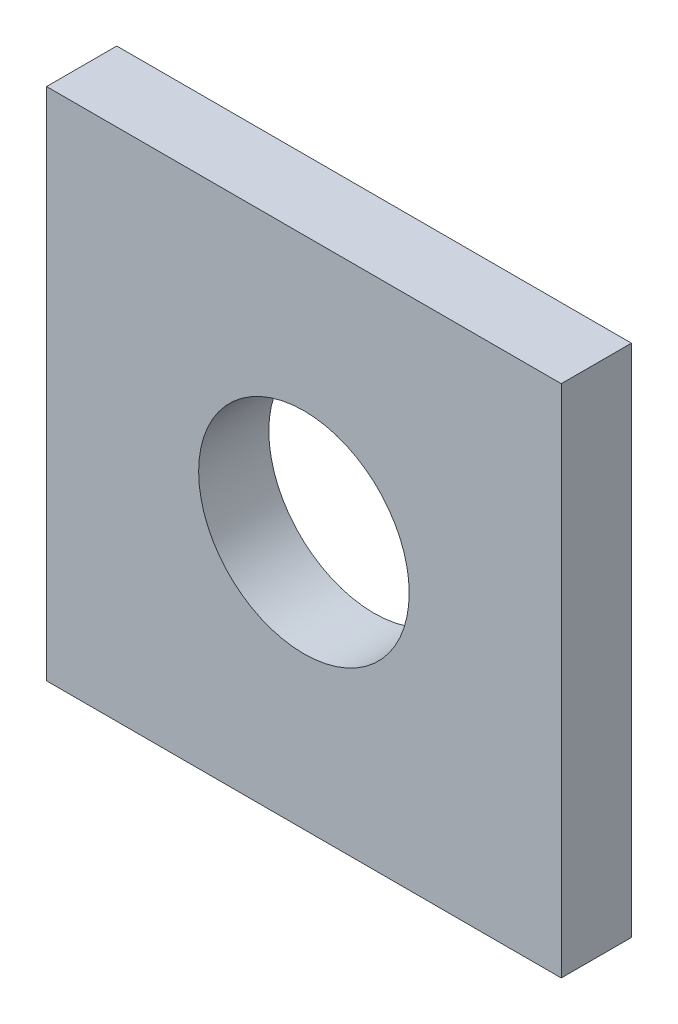
ISO-10303-21;
HEADER;
FILE_DESCRIPTION(('STEP AP214'),'2;1');
FILE_NAME('part.step','',(''),(''),'','','');
FILE_SCHEMA(('AUTOMOTIVE_DESIGN { 1 0 10303 214 1 1 1 1 }'));
ENDSEC;
DATA;
#1=APPLICATION_CONTEXT('core data for automotive mechanical design processes');
#2=APPLICATION_PROTOCOL_DEFINITION('international standard','automotive_design',2000,#1);
#3=PRODUCT_CONTEXT('',#1,'mechanical');
#4=PRODUCT('Part','Part','',(#3));
#5=PRODUCT_RELATED_PRODUCT_CATEGORY('part','',(#4));
#6=PRODUCT_DEFINITION_FORMATION('','',#4);
#7=PRODUCT_DEFINITION_CONTEXT('part definition',#1,'design');
#8=PRODUCT_DEFINITION('design','',#6,#7);
#9=PRODUCT_DEFINITION_SHAPE('','',#8);
#10=(LENGTH_UNIT() NAMED_UNIT(*) SI_UNIT(.MILLI.,.METRE.));
#11=(NAMED_UNIT(*) PLANE_ANGLE_UNIT() SI_UNIT($,.RADIAN.));
#12=(NAMED_UNIT(*) SI_UNIT($,.STERADIAN.) SOLID_ANGLE_UNIT());
#13=UNCERTAINTY_MEASURE_WITH_UNIT(LENGTH_MEASURE(1.E-05),#10,'distance_accuracy_value','');
#14=(GEOMETRIC_REPRESENTATION_CONTEXT(3) GLOBAL_UNCERTAINTY_ASSIGNED_CONTEXT((#13)) GLOBAL_UNIT_ASSIGNED_CONTEXT((#10,
#11,#12)) REPRESENTATION_CONTEXT('',''));
#15=CARTESIAN_POINT('',(0.,0.,0.));
#16=DIRECTION('',(0.,0.,1.));
#17=DIRECTION('',(1.,0.,0.));
#18=AXIS2_PLACEMENT_3D('',#15,#16,#17);
#19=CARTESIAN_POINT('',(0.,0.,3.));
#20=DIRECTION('',(0.,0.,-1.));
#21=DIRECTION('',(-1.,0.,0.));
#22=AXIS2_PLACEMENT_3D('',#19,#20,#21);
#23=PLANE('',#22);
#24=DIRECTION('',(0.,-1.,0.));
#25=VECTOR('',#24,1.);
#26=CARTESIAN_POINT('',(0.,0.,3.));
#27=LINE('',#26,#25);
#28=CARTESIAN_POINT('',(0.,22.,3.));
#29=VERTEX_POINT('',#28);
#30=CARTESIAN_POINT('',(0.,0.,3.));
#31=VERTEX_POINT('',#30);
#32=EDGE_CURVE('E99',#29,#31,#27,.T.);
#33=ORIENTED_EDGE('',*,*,#32,.T.);
#34=DIRECTION('',(1.,0.,0.));
#35=VECTOR('',#34,1.);
#36=CARTESIAN_POINT('',(0.,0.,3.));
#37=LINE('',#36,#35);
#38=CARTESIAN_POINT('',(22.,0.,3.));
#39=VERTEX_POINT('',#38);
#40=EDGE_CURVE('E94',#31,#39,#37,.T.);
#41=ORIENTED_EDGE('',*,*,#40,.T.);
#42=DIRECTION('',(0.,1.,0.));
#43=VECTOR('',#42,1.);
#44=CARTESIAN_POINT('',(22.,0.,3.));
#45=LINE('',#44,#43);
#46=CARTESIAN_POINT('',(22.,22.,3.));
#47=VERTEX_POINT('',#46);
#48=EDGE_CURVE('E97',#39,#47,#45,.T.);
#49=ORIENTED_EDGE('',*,*,#48,.T.);
#50=DIRECTION('',(-1.,0.,0.));
#51=VECTOR('',#50,1.);
#52=CARTESIAN_POINT('',(0.,22.,3.));
#53=LINE('',#52,#51);
#54=EDGE_CURVE('E64',#47,#29,#53,.T.);
#55=ORIENTED_EDGE('',*,*,#54,.T.);
#56=EDGE_LOOP('',(#33,#41,#49,#55));
#57=FACE_BOUND('',#56,.T.);
#58=CARTESIAN_POINT('',(11.,11.,3.));
#59=DIRECTION('',(0.,0.,1.));
#60=DIRECTION('',(1.,0.,0.));
#61=AXIS2_PLACEMENT_3D('',#58,#59,#60);
#62=CIRCLE('',#61,4.5);
#63=CARTESIAN_POINT('',(15.5,11.,3.));
#64=VERTEX_POINT('',#63);
#65=EDGE_CURVE('E114',#64,#64,#62,.T.);
#66=ORIENTED_EDGE('',*,*,#65,.F.);
#67=EDGE_LOOP('',(#66));
#68=FACE_BOUND('',#67,.T.);
#69=ADVANCED_FACE('F47',(#57,#68),#23,.F.);
#70=CARTESIAN_POINT('',(0.,0.,0.));
#71=DIRECTION('',(0.,0.,-1.));
#72=DIRECTION('',(-1.,0.,0.));
#73=AXIS2_PLACEMENT_3D('',#70,#71,#72);
#74=PLANE('',#73);
#75=DIRECTION('',(0.,-1.,0.));
#76=VECTOR('',#75,1.);
#77=CARTESIAN_POINT('',(0.,0.,0.));
#78=LINE('',#77,#76);
#79=CARTESIAN_POINT('',(0.,22.,0.));
#80=VERTEX_POINT('',#79);
#81=CARTESIAN_POINT('',(0.,0.,0.));
#82=VERTEX_POINT('',#81);
#83=EDGE_CURVE('E111',#80,#82,#78,.T.);
#84=ORIENTED_EDGE('',*,*,#83,.F.);
#85=DIRECTION('',(-1.,0.,0.));
#86=VECTOR('',#85,1.);
#87=CARTESIAN_POINT('',(0.,22.,0.));
#88=LINE('',#87,#86);
#89=CARTESIAN_POINT('',(22.,22.,0.));
#90=VERTEX_POINT('',#89);
#91=EDGE_CURVE('E87',#90,#80,#88,.T.);
#92=ORIENTED_EDGE('',*,*,#91,.F.);
#93=DIRECTION('',(0.,1.,0.));
#94=VECTOR('',#93,1.);
#95=CARTESIAN_POINT('',(22.,0.,0.));
#96=LINE('',#95,#94);
#97=CARTESIAN_POINT('',(22.,0.,0.));
#98=VERTEX_POINT('',#97);
#99=EDGE_CURVE('E81',#98,#90,#96,.T.);
#100=ORIENTED_EDGE('',*,*,#99,.F.);
#101=DIRECTION('',(1.,0.,0.));
#102=VECTOR('',#101,1.);
#103=CARTESIAN_POINT('',(0.,0.,0.));
#104=LINE('',#103,#102);
#105=EDGE_CURVE('E103',#82,#98,#104,.T.);
#106=ORIENTED_EDGE('',*,*,#105,.F.);
#107=EDGE_LOOP('',(#84,#92,#100,#106));
#108=FACE_BOUND('',#107,.T.);
#109=CARTESIAN_POINT('',(11.,11.,0.));
#110=DIRECTION('',(0.,0.,1.));
#111=DIRECTION('',(1.,0.,0.));
#112=AXIS2_PLACEMENT_3D('',#109,#110,#111);
#113=CIRCLE('',#112,4.5);
#114=CARTESIAN_POINT('',(15.5,11.,0.));
#115=VERTEX_POINT('',#114);
#116=EDGE_CURVE('E126',#115,#115,#113,.T.);
#117=ORIENTED_EDGE('',*,*,#116,.T.);
#118=EDGE_LOOP('',(#117));
#119=FACE_BOUND('',#118,.T.);
#120=ADVANCED_FACE('F122',(#108,#119),#74,.T.);
#121=CARTESIAN_POINT('',(0.,0.,3.));
#122=DIRECTION('',(1.,0.,0.));
#123=DIRECTION('',(0.,0.,-1.));
#124=AXIS2_PLACEMENT_3D('',#121,#122,#123);
#125=PLANE('',#124);
#126=ORIENTED_EDGE('',*,*,#83,.T.);
#127=DIRECTION('',(0.,0.,-1.));
#128=VECTOR('',#127,1.);
#129=CARTESIAN_POINT('',(0.,0.,3.));
#130=LINE('',#129,#128);
#131=EDGE_CURVE('E13',#31,#82,#130,.T.);
#132=ORIENTED_EDGE('',*,*,#131,.F.);
#133=ORIENTED_EDGE('',*,*,#32,.F.);
#134=DIRECTION('',(0.,0.,-1.));
#135=VECTOR('',#134,1.);
#136=CARTESIAN_POINT('',(0.,22.,3.));
#137=LINE('',#136,#135);
#138=EDGE_CURVE('E107',#29,#80,#137,.T.);
#139=ORIENTED_EDGE('',*,*,#138,.T.);
#140=EDGE_LOOP('',(#126,#132,#133,#139));
#141=FACE_BOUND('',#140,.T.);
#142=ADVANCED_FACE('F49',(#141),#125,.F.);
#143=CARTESIAN_POINT('',(0.,0.,3.));
#144=DIRECTION('',(0.,1.,0.));
#145=DIRECTION('',(0.,0.,1.));
#146=AXIS2_PLACEMENT_3D('',#143,#144,#145);
#147=PLANE('',#146);
#148=ORIENTED_EDGE('',*,*,#105,.T.);
#149=DIRECTION('',(0.,0.,-1.));
#150=VECTOR('',#149,1.);
#151=CARTESIAN_POINT('',(22.,0.,3.));
#152=LINE('',#151,#150);
#153=EDGE_CURVE('E56',#39,#98,#152,.T.);
#154=ORIENTED_EDGE('',*,*,#153,.F.);
#155=ORIENTED_EDGE('',*,*,#40,.F.);
#156=ORIENTED_EDGE('',*,*,#131,.T.);
#157=EDGE_LOOP('',(#148,#154,#155,#156));
#158=FACE_BOUND('',#157,.T.);
#159=ADVANCED_FACE('F102',(#158),#147,.F.);
#160=CARTESIAN_POINT('',(22.,0.,3.));
#161=DIRECTION('',(-1.,0.,0.));
#162=DIRECTION('',(0.,0.,1.));
#163=AXIS2_PLACEMENT_3D('',#160,#161,#162);
#164=PLANE('',#163);
#165=ORIENTED_EDGE('',*,*,#99,.T.);
#166=DIRECTION('',(0.,0.,-1.));
#167=VECTOR('',#166,1.);
#168=CARTESIAN_POINT('',(22.,22.,3.));
#169=LINE('',#168,#167);
#170=EDGE_CURVE('E104',#47,#90,#169,.T.);
#171=ORIENTED_EDGE('',*,*,#170,.F.);
#172=ORIENTED_EDGE('',*,*,#48,.F.);
#173=ORIENTED_EDGE('',*,*,#153,.T.);
#174=EDGE_LOOP('',(#165,#171,#172,#173));
#175=FACE_BOUND('',#174,.T.);
#176=ADVANCED_FACE('F105',(#175),#164,.F.);
#177=CARTESIAN_POINT('',(0.,22.,3.));
#178=DIRECTION('',(0.,-1.,0.));
#179=DIRECTION('',(0.,0.,-1.));
#180=AXIS2_PLACEMENT_3D('',#177,#178,#179);
#181=PLANE('',#180);
#182=ORIENTED_EDGE('',*,*,#91,.T.);
#183=ORIENTED_EDGE('',*,*,#138,.F.);
#184=ORIENTED_EDGE('',*,*,#54,.F.);
#185=ORIENTED_EDGE('',*,*,#170,.T.);
#186=EDGE_LOOP('',(#182,#183,#184,#185));
#187=FACE_BOUND('',#186,.T.);
#188=ADVANCED_FACE('F119',(#187),#181,.F.);
#189=CARTESIAN_POINT('',(11.,11.,3.));
#190=DIRECTION('',(0.,0.,-1.));
#191=DIRECTION('',(-1.,0.,0.));
#192=AXIS2_PLACEMENT_3D('',#189,#190,#191);
#193=CYLINDRICAL_SURFACE('',#192,4.5);
#194=ORIENTED_EDGE('',*,*,#65,.T.);
#195=EDGE_LOOP('',(#194));
#196=FACE_BOUND('',#195,.T.);
#197=ORIENTED_EDGE('',*,*,#116,.F.);
#198=EDGE_LOOP('',(#197));
#199=FACE_BOUND('',#198,.T.);
#200=ADVANCED_FACE('F132',(#196,#199),#193,.F.);
#201=CLOSED_SHELL('',(#69,#120,#142,#159,#176,#188,#200));
#202=MANIFOLD_SOLID_BREP('B2',#201);
#203=ADVANCED_BREP_SHAPE_REPRESENTATION('',(#18,#202),#14);
#204=SHAPE_DEFINITION_REPRESENTATION(#9,#203);
ENDSEC;
END-ISO-10303-21;
